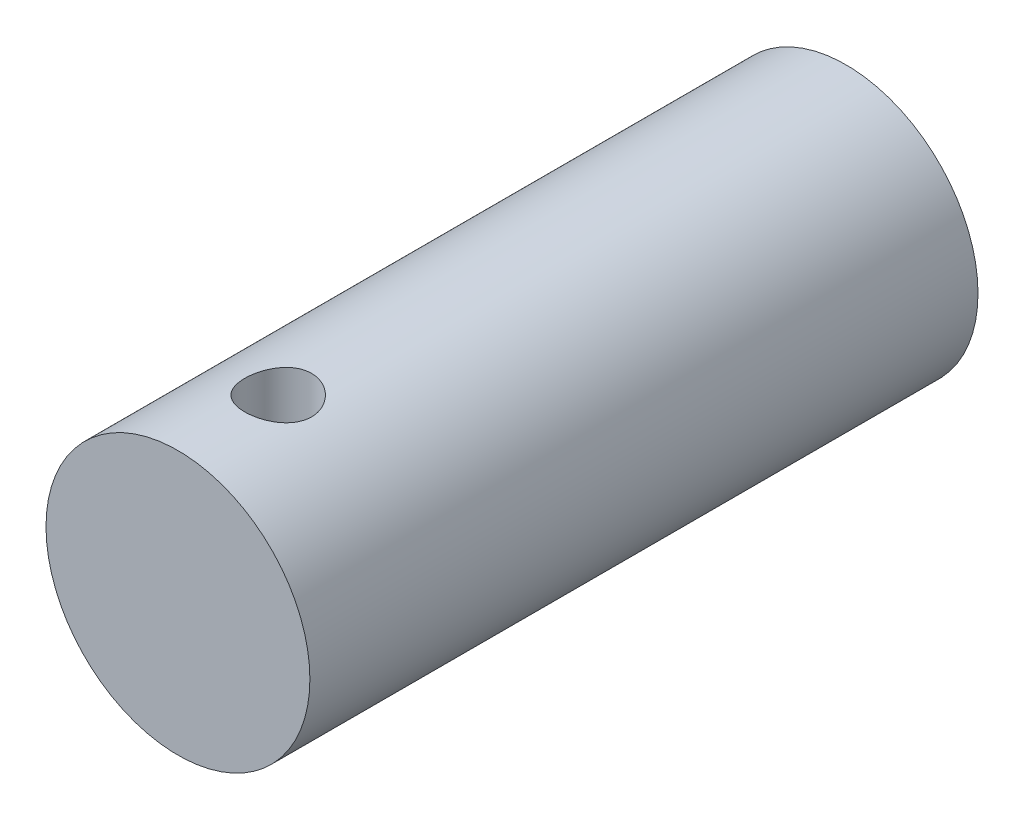
ISO-10303-21;
HEADER;
FILE_DESCRIPTION(('STEP AP214'),'2;1');
FILE_NAME('part.step','',(''),(''),'','','');
FILE_SCHEMA(('AUTOMOTIVE_DESIGN { 1 0 10303 214 1 1 1 1 }'));
ENDSEC;
DATA;
#1=APPLICATION_CONTEXT('core data for automotive mechanical design processes');
#2=APPLICATION_PROTOCOL_DEFINITION('international standard','automotive_design',2000,#1);
#3=PRODUCT_CONTEXT('',#1,'mechanical');
#4=PRODUCT('Part','Part','',(#3));
#5=PRODUCT_RELATED_PRODUCT_CATEGORY('part','',(#4));
#6=PRODUCT_DEFINITION_FORMATION('','',#4);
#7=PRODUCT_DEFINITION_CONTEXT('part definition',#1,'design');
#8=PRODUCT_DEFINITION('design','',#6,#7);
#9=PRODUCT_DEFINITION_SHAPE('','',#8);
#10=(LENGTH_UNIT() NAMED_UNIT(*) SI_UNIT(.MILLI.,.METRE.));
#11=(NAMED_UNIT(*) PLANE_ANGLE_UNIT() SI_UNIT($,.RADIAN.));
#12=(NAMED_UNIT(*) SI_UNIT($,.STERADIAN.) SOLID_ANGLE_UNIT());
#13=UNCERTAINTY_MEASURE_WITH_UNIT(LENGTH_MEASURE(1.E-05),#10,'distance_accuracy_value','');
#14=(GEOMETRIC_REPRESENTATION_CONTEXT(3) GLOBAL_UNCERTAINTY_ASSIGNED_CONTEXT((#13)) GLOBAL_UNIT_ASSIGNED_CONTEXT((#10,
#11,#12)) REPRESENTATION_CONTEXT('',''));
#15=CARTESIAN_POINT('',(0.,0.,0.));
#16=DIRECTION('',(0.,0.,1.));
#17=DIRECTION('',(1.,0.,0.));
#18=AXIS2_PLACEMENT_3D('',#15,#16,#17);
#19=CARTESIAN_POINT('',(0.,0.,20.));
#20=DIRECTION('',(0.,0.,-1.));
#21=DIRECTION('',(-1.,0.,0.));
#22=AXIS2_PLACEMENT_3D('',#19,#20,#21);
#23=CYLINDRICAL_SURFACE('',#22,3.95);
#24=CARTESIAN_POINT('',(0.,-3.95,18.));
#25=CARTESIAN_POINT('',(0.0552278420748469,-3.94999908204684,17.9999984919513));
#26=CARTESIAN_POINT('',(0.110472396400867,-3.94883021486781,17.9954094463953));
#27=CARTESIAN_POINT('',(0.219376684770794,-3.9442806794472,17.97720292985));
#28=CARTESIAN_POINT('',(0.27303552875615,-3.94089879279058,17.963580485316));
#29=CARTESIAN_POINT('',(0.377180122437892,-3.93229748362604,17.9277734243036));
#30=CARTESIAN_POINT('',(0.427669648348493,-3.92708029878769,17.905599231305));
#31=CARTESIAN_POINT('',(0.524212415434038,-3.91536323222111,17.853355156036));
#32=CARTESIAN_POINT('',(0.570265479338116,-3.90886329926881,17.8232849584381));
#33=CARTESIAN_POINT('',(0.657598787580676,-3.89513247989479,17.7554330059679));
#34=CARTESIAN_POINT('',(0.698772196504418,-3.88789008700224,17.7175160639065));
#35=CARTESIAN_POINT('',(0.774248675231096,-3.87356657479427,17.6353362974195));
#36=CARTESIAN_POINT('',(0.808550949886455,-3.86648547422801,17.5910727395611));
#37=CARTESIAN_POINT('',(0.869817310360346,-3.85316997858545,17.4966223853375));
#38=CARTESIAN_POINT('',(0.896661257761203,-3.8469501747132,17.4463554153543));
#39=CARTESIAN_POINT('',(0.941476144800429,-3.83622956373611,17.3418392875935));
#40=CARTESIAN_POINT('',(0.959448542826903,-3.83172847412054,17.2875907860226));
#41=CARTESIAN_POINT('',(0.985644478007742,-3.82507328273172,17.1778278560477));
#42=CARTESIAN_POINT('',(0.994060408757436,-3.82287293653174,17.1223622138155));
#43=CARTESIAN_POINT('',(1.00150389012776,-3.82092998774723,17.0107660302749));
#44=CARTESIAN_POINT('',(1.00053300964121,-3.8211869744489,16.9546356016439));
#45=CARTESIAN_POINT('',(0.98938378930083,-3.82408811953594,16.8447827031134));
#46=CARTESIAN_POINT('',(0.979435358626881,-3.826672667255,16.7910350782057));
#47=CARTESIAN_POINT('',(0.950980465859901,-3.83384263855054,16.6859976717028));
#48=CARTESIAN_POINT('',(0.932473380267746,-3.83842820790033,16.6347080694755));
#49=CARTESIAN_POINT('',(0.887232199279391,-3.84913783092387,16.5354293350022));
#50=CARTESIAN_POINT('',(0.860415192377698,-3.85527726966643,16.4874797148559));
#51=CARTESIAN_POINT('',(0.799373363875984,-3.86839426326203,16.3966789214503));
#52=CARTESIAN_POINT('',(0.765147215691907,-3.87537196810434,16.3538286633482));
#53=CARTESIAN_POINT('',(0.689070600726196,-3.88962974437686,16.2731261564652));
#54=CARTESIAN_POINT('',(0.647026292795693,-3.89691268804759,16.2354569106575));
#55=CARTESIAN_POINT('',(0.557129757116956,-3.91077635595212,16.1676685772219));
#56=CARTESIAN_POINT('',(0.509277343022367,-3.91735705764256,16.137549731935));
#57=CARTESIAN_POINT('',(0.408857714757762,-3.92910890000828,16.085647507278));
#58=CARTESIAN_POINT('',(0.356274170552657,-3.93427488867099,16.0638944807668));
#59=CARTESIAN_POINT('',(0.248036539264747,-3.94257781835689,16.029588127079));
#60=CARTESIAN_POINT('',(0.192383057256601,-3.94571515768035,16.017032993945));
#61=CARTESIAN_POINT('',(0.0811494612569926,-3.94954811388858,16.0017597574516));
#62=CARTESIAN_POINT('',(0.0256056354836739,-3.95030555646106,15.9987925174488));
#63=CARTESIAN_POINT('',(-0.0851851389097121,-3.94946977470528,16.0020951088027));
#64=CARTESIAN_POINT('',(-0.140432114506926,-3.94787676773552,16.0083640860373));
#65=CARTESIAN_POINT('',(-0.24819084473572,-3.94255875874206,16.029755979187));
#66=CARTESIAN_POINT('',(-0.30073146299795,-3.93886663987927,16.0447424155926));
#67=CARTESIAN_POINT('',(-0.402549796122122,-3.92976700717265,16.0829874461133));
#68=CARTESIAN_POINT('',(-0.451827176068225,-3.92435931758351,16.1062468877555));
#69=CARTESIAN_POINT('',(-0.546707172047591,-3.91228090485966,16.1608566564906));
#70=CARTESIAN_POINT('',(-0.592227150944137,-3.90558909631277,16.1923457822197));
#71=CARTESIAN_POINT('',(-0.677425134789229,-3.89171704587319,16.2623441926733));
#72=CARTESIAN_POINT('',(-0.717102102215168,-3.88453671756594,16.3008547214526));
#73=CARTESIAN_POINT('',(-0.790518789323268,-3.87027341917479,16.3849606856098));
#74=CARTESIAN_POINT('',(-0.824083545405224,-3.86319747090773,16.4307103011257));
#75=CARTESIAN_POINT('',(-0.883059964621527,-3.85014558107987,16.5273391068464));
#76=CARTESIAN_POINT('',(-0.908471987221515,-3.84416959102531,16.5782180707609));
#77=CARTESIAN_POINT('',(-0.950231584598359,-3.83406073969026,16.683391004948));
#78=CARTESIAN_POINT('',(-0.96663279213701,-3.82991700223301,16.7376625795714));
#79=CARTESIAN_POINT('',(-0.990044181657134,-3.82393269795229,16.8483142073805));
#80=CARTESIAN_POINT('',(-0.997056480178927,-3.82209161204859,16.9046937824133));
#81=CARTESIAN_POINT('',(-1.00137829764814,-3.82096134400262,17.0161786121732));
#82=CARTESIAN_POINT('',(-0.998967740557094,-3.82159853697847,17.0712724404118));
#83=CARTESIAN_POINT('',(-0.985154533235013,-3.82518240754788,17.1802405863909));
#84=CARTESIAN_POINT('',(-0.973752072713341,-3.82812903641742,17.2341149298351));
#85=CARTESIAN_POINT('',(-0.942433404844572,-3.83595820613518,17.3388015753129));
#86=CARTESIAN_POINT('',(-0.922570964111821,-3.8408285072964,17.3896309410624));
#87=CARTESIAN_POINT('',(-0.874938511416826,-3.85195770365967,17.4872725232274));
#88=CARTESIAN_POINT('',(-0.847167375213231,-3.85821679625402,17.5340841672814));
#89=CARTESIAN_POINT('',(-0.783633699377765,-3.87162721456458,17.6237111284221));
#90=CARTESIAN_POINT('',(-0.747677518801082,-3.8787979067106,17.6663863039087));
#91=CARTESIAN_POINT('',(-0.669170094379428,-3.8931093778377,17.7451882925208));
#92=CARTESIAN_POINT('',(-0.626617280405068,-3.90025014928039,17.7813135421814));
#93=CARTESIAN_POINT('',(-0.535163954139943,-3.91385664534171,17.8466500449191));
#94=CARTESIAN_POINT('',(-0.486159605851861,-3.92030724668928,17.8757193487147));
#95=CARTESIAN_POINT('',(-0.383800172167365,-3.93164601340821,17.9251609888441));
#96=CARTESIAN_POINT('',(-0.330448176331422,-3.93653527636488,17.9455394380465));
#97=CARTESIAN_POINT('',(-0.231008135572119,-3.9434943052563,17.9740634112027));
#98=CARTESIAN_POINT('',(-0.185385804626639,-3.94591699651009,17.9837683239816));
#99=CARTESIAN_POINT('',(-0.0931795635500843,-3.94917016803465,17.996736999342));
#100=CARTESIAN_POINT('',(-0.0465957299132142,-3.95000077447707,18.0000012723407));
#101=CARTESIAN_POINT('',(0.,-3.95,18.));
#102=B_SPLINE_CURVE_WITH_KNOTS('',3,(#24,#25,#26,#27,#28,#29,#30,#31,#32,#33,#34,#35,#36,#37,
#38,#39,#40,#41,#42,#43,#44,#45,#46,#47,#48,#49,#50,#51,#52,#53,#54,#55,#56,#57,#58,#59,#60,#61,
#62,#63,#64,#65,#66,#67,#68,#69,#70,#71,#72,#73,#74,#75,#76,#77,#78,#79,#80,#81,#82,#83,#84,#85,
#86,#87,#88,#89,#90,#91,#92,#93,#94,#95,#96,#97,#98,#99,#100,#101),.UNSPECIFIED.,.T.,.F.,(4,2,2,
2,2,2,2,2,2,2,2,2,2,2,2,2,2,2,2,2,2,2,2,2,2,2,2,2,2,2,2,2,2,2,2,2,2,2,4),(0.,0.165512747530338,
0.331116697640765,0.496519432574112,0.661928773883154,0.830468884011725,0.999028486836985,
1.17016372163742,1.34127081425357,1.50886841059759,1.6764379954995,1.83983434666397,
2.00324260314947,2.16833681236569,2.3334606056793,2.50341757273773,2.67337999411055,
2.84395338273747,3.01449327120703,3.18056455367168,3.34662047960915,3.51014407075123,
3.67368441887731,3.84018425250062,4.00671361534653,4.17744263350462,4.34816412294207,
4.51785814720793,4.6875139109316,4.85216858434357,5.01681978399747,5.18043981589751,
5.34408311842491,5.51209741294959,5.68015175977974,5.8513492293213,6.02242608465512,
6.16208025636819,6.30172336012491),.UNSPECIFIED.);
#103=CARTESIAN_POINT('',(0.,-3.95,18.));
#104=VERTEX_POINT('',#103);
#105=EDGE_CURVE('E46',#104,#104,#102,.T.);
#106=ORIENTED_EDGE('',*,*,#105,.T.);
#107=EDGE_LOOP('',(#106));
#108=FACE_BOUND('',#107,.T.);
#109=CARTESIAN_POINT('',(0.,3.95,18.));
#110=CARTESIAN_POINT('',(-0.0552278420748467,3.94999908204684,17.9999984919513));
#111=CARTESIAN_POINT('',(-0.110472396400866,3.94883021486781,17.9954094463953));
#112=CARTESIAN_POINT('',(-0.219376684770793,3.9442806794472,17.97720292985));
#113=CARTESIAN_POINT('',(-0.27303552875615,3.94089879279058,17.963580485316));
#114=CARTESIAN_POINT('',(-0.377180122437892,3.93229748362604,17.9277734243036));
#115=CARTESIAN_POINT('',(-0.427669648348493,3.92708029878769,17.905599231305));
#116=CARTESIAN_POINT('',(-0.524212415434038,3.91536323222111,17.853355156036));
#117=CARTESIAN_POINT('',(-0.570265479338116,3.90886329926881,17.8232849584381));
#118=CARTESIAN_POINT('',(-0.657598787580675,3.89513247989479,17.7554330059679));
#119=CARTESIAN_POINT('',(-0.698772196504418,3.88789008700224,17.7175160639065));
#120=CARTESIAN_POINT('',(-0.774248675231096,3.87356657479427,17.6353362974195));
#121=CARTESIAN_POINT('',(-0.808550949886455,3.86648547422801,17.5910727395611));
#122=CARTESIAN_POINT('',(-0.869817310360346,3.85316997858545,17.4966223853375));
#123=CARTESIAN_POINT('',(-0.896661257761203,3.8469501747132,17.4463554153543));
#124=CARTESIAN_POINT('',(-0.941476144800429,3.83622956373611,17.3418392875935));
#125=CARTESIAN_POINT('',(-0.959448542826903,3.83172847412054,17.2875907860226));
#126=CARTESIAN_POINT('',(-0.985644478007742,3.82507328273172,17.1778278560477));
#127=CARTESIAN_POINT('',(-0.994060408757436,3.82287293653174,17.1223622138155));
#128=CARTESIAN_POINT('',(-1.00150389012776,3.82092998774723,17.0107660302749));
#129=CARTESIAN_POINT('',(-1.00053300964121,3.8211869744489,16.9546356016439));
#130=CARTESIAN_POINT('',(-0.98938378930083,3.82408811953594,16.8447827031134));
#131=CARTESIAN_POINT('',(-0.979435358626881,3.826672667255,16.7910350782057));
#132=CARTESIAN_POINT('',(-0.950980465859901,3.83384263855054,16.6859976717028));
#133=CARTESIAN_POINT('',(-0.932473380267746,3.83842820790033,16.6347080694755));
#134=CARTESIAN_POINT('',(-0.887232199279391,3.84913783092387,16.5354293350022));
#135=CARTESIAN_POINT('',(-0.860415192377698,3.85527726966643,16.4874797148559));
#136=CARTESIAN_POINT('',(-0.799373363875984,3.86839426326203,16.3966789214503));
#137=CARTESIAN_POINT('',(-0.765147215691907,3.87537196810434,16.3538286633482));
#138=CARTESIAN_POINT('',(-0.689070600726195,3.88962974437686,16.2731261564652));
#139=CARTESIAN_POINT('',(-0.647026292795693,3.89691268804759,16.2354569106575));
#140=CARTESIAN_POINT('',(-0.557129757116955,3.91077635595212,16.1676685772219));
#141=CARTESIAN_POINT('',(-0.509277343022367,3.91735705764256,16.137549731935));
#142=CARTESIAN_POINT('',(-0.408857714757762,3.92910890000828,16.085647507278));
#143=CARTESIAN_POINT('',(-0.356274170552657,3.93427488867099,16.0638944807668));
#144=CARTESIAN_POINT('',(-0.248036539264748,3.94257781835689,16.029588127079));
#145=CARTESIAN_POINT('',(-0.192383057256601,3.94571515768035,16.017032993945));
#146=CARTESIAN_POINT('',(-0.0811494612569926,3.94954811388858,16.0017597574516));
#147=CARTESIAN_POINT('',(-0.0256056354836739,3.95030555646106,15.9987925174488));
#148=CARTESIAN_POINT('',(0.0851851389097121,3.94946977470528,16.0020951088027));
#149=CARTESIAN_POINT('',(0.140432114506926,3.94787676773552,16.0083640860373));
#150=CARTESIAN_POINT('',(0.24819084473572,3.94255875874206,16.029755979187));
#151=CARTESIAN_POINT('',(0.30073146299795,3.93886663987927,16.0447424155926));
#152=CARTESIAN_POINT('',(0.402549796122122,3.92976700717265,16.0829874461133));
#153=CARTESIAN_POINT('',(0.451827176068225,3.92435931758351,16.1062468877555));
#154=CARTESIAN_POINT('',(0.546707172047591,3.91228090485966,16.1608566564906));
#155=CARTESIAN_POINT('',(0.592227150944137,3.90558909631277,16.1923457822197));
#156=CARTESIAN_POINT('',(0.677425134789229,3.89171704587319,16.2623441926733));
#157=CARTESIAN_POINT('',(0.717102102215169,3.88453671756594,16.3008547214526));
#158=CARTESIAN_POINT('',(0.790518789323267,3.87027341917479,16.3849606856097));
#159=CARTESIAN_POINT('',(0.824083545405221,3.86319747090773,16.4307103011257));
#160=CARTESIAN_POINT('',(0.883059964621525,3.85014558107988,16.5273391068464));
#161=CARTESIAN_POINT('',(0.908471987221515,3.84416959102531,16.5782180707609));
#162=CARTESIAN_POINT('',(0.950231584598359,3.83406073969026,16.683391004948));
#163=CARTESIAN_POINT('',(0.96663279213701,3.82991700223301,16.7376625795714));
#164=CARTESIAN_POINT('',(0.990044181657134,3.82393269795229,16.8483142073805));
#165=CARTESIAN_POINT('',(0.997056480178927,3.82209161204859,16.9046937824133));
#166=CARTESIAN_POINT('',(1.00137829764814,3.82096134400262,17.0161786121732));
#167=CARTESIAN_POINT('',(0.998967740557094,3.82159853697847,17.0712724404118));
#168=CARTESIAN_POINT('',(0.985154533235013,3.82518240754788,17.1802405863909));
#169=CARTESIAN_POINT('',(0.973752072713341,3.82812903641742,17.2341149298351));
#170=CARTESIAN_POINT('',(0.942433404844572,3.83595820613518,17.3388015753129));
#171=CARTESIAN_POINT('',(0.922570964111821,3.8408285072964,17.3896309410624));
#172=CARTESIAN_POINT('',(0.874938511416826,3.85195770365967,17.4872725232274));
#173=CARTESIAN_POINT('',(0.847167375213231,3.85821679625402,17.5340841672814));
#174=CARTESIAN_POINT('',(0.783633699377765,3.87162721456458,17.6237111284221));
#175=CARTESIAN_POINT('',(0.747677518801082,3.8787979067106,17.6663863039087));
#176=CARTESIAN_POINT('',(0.669170094379428,3.8931093778377,17.7451882925208));
#177=CARTESIAN_POINT('',(0.626617280405068,3.90025014928039,17.7813135421814));
#178=CARTESIAN_POINT('',(0.535163954139943,3.91385664534171,17.8466500449191));
#179=CARTESIAN_POINT('',(0.486159605851861,3.92030724668928,17.8757193487147));
#180=CARTESIAN_POINT('',(0.383800172167365,3.93164601340821,17.9251609888441));
#181=CARTESIAN_POINT('',(0.330448176331422,3.93653527636488,17.9455394380465));
#182=CARTESIAN_POINT('',(0.231008135572118,3.9434943052563,17.9740634112027));
#183=CARTESIAN_POINT('',(0.185385804626639,3.94591699651009,17.9837683239816));
#184=CARTESIAN_POINT('',(0.0931795635500843,3.94917016803465,17.996736999342));
#185=CARTESIAN_POINT('',(0.0465957299132142,3.95000077447708,18.0000012723407));
#186=CARTESIAN_POINT('',(0.,3.95,18.));
#187=B_SPLINE_CURVE_WITH_KNOTS('',3,(#109,#110,#111,#112,#113,#114,#115,#116,#117,#118,#119,
#120,#121,#122,#123,#124,#125,#126,#127,#128,#129,#130,#131,#132,#133,#134,#135,#136,#137,#138,
#139,#140,#141,#142,#143,#144,#145,#146,#147,#148,#149,#150,#151,#152,#153,#154,#155,#156,#157,
#158,#159,#160,#161,#162,#163,#164,#165,#166,#167,#168,#169,#170,#171,#172,#173,#174,#175,#176,
#177,#178,#179,#180,#181,#182,#183,#184,#185,#186),.UNSPECIFIED.,.T.,.F.,(4,2,2,2,2,2,2,2,2,2,2,
2,2,2,2,2,2,2,2,2,2,2,2,2,2,2,2,2,2,2,2,2,2,2,2,2,2,2,4),(0.,0.165512747530337,
0.331116697640765,0.496519432574112,0.661928773883154,0.830468884011725,0.999028486836985,
1.17016372163742,1.34127081425357,1.50886841059759,1.6764379954995,1.83983434666397,
2.00324260314947,2.16833681236569,2.3334606056793,2.50341757273773,2.67337999411055,
2.84395338273747,3.01449327120703,3.18056455367168,3.34662047960915,3.51014407075123,
3.67368441887731,3.84018425250062,4.00671361534653,4.17744263350461,4.34816412294207,
4.51785814720793,4.6875139109316,4.85216858434357,5.01681978399747,5.18043981589751,
5.34408311842491,5.51209741294959,5.68015175977974,5.85134922932129,6.02242608465512,
6.16208025636819,6.30172336012491),.UNSPECIFIED.);
#188=CARTESIAN_POINT('',(0.,3.95,18.));
#189=VERTEX_POINT('',#188);
#190=EDGE_CURVE('E12',#189,#189,#187,.T.);
#191=ORIENTED_EDGE('',*,*,#190,.T.);
#192=EDGE_LOOP('',(#191));
#193=FACE_BOUND('',#192,.T.);
#194=CARTESIAN_POINT('',(0.,0.,20.));
#195=DIRECTION('',(0.,0.,1.));
#196=DIRECTION('',(1.,0.,0.));
#197=AXIS2_PLACEMENT_3D('',#194,#195,#196);
#198=CIRCLE('',#197,3.95);
#199=CARTESIAN_POINT('',(3.95,0.,20.));
#200=VERTEX_POINT('',#199);
#201=EDGE_CURVE('E53',#200,#200,#198,.T.);
#202=ORIENTED_EDGE('',*,*,#201,.F.);
#203=EDGE_LOOP('',(#202));
#204=FACE_BOUND('',#203,.T.);
#205=CARTESIAN_POINT('',(0.,0.,0.));
#206=DIRECTION('',(0.,0.,1.));
#207=DIRECTION('',(1.,0.,0.));
#208=AXIS2_PLACEMENT_3D('',#205,#206,#207);
#209=CIRCLE('',#208,3.95);
#210=CARTESIAN_POINT('',(3.95,0.,0.));
#211=VERTEX_POINT('',#210);
#212=EDGE_CURVE('E57',#211,#211,#209,.T.);
#213=ORIENTED_EDGE('',*,*,#212,.T.);
#214=EDGE_LOOP('',(#213));
#215=FACE_BOUND('',#214,.T.);
#216=ADVANCED_FACE('F42',(#108,#193,#204,#215),#23,.T.);
#217=CARTESIAN_POINT('',(0.,0.,20.));
#218=DIRECTION('',(0.,0.,1.));
#219=DIRECTION('',(1.,0.,0.));
#220=AXIS2_PLACEMENT_3D('',#217,#218,#219);
#221=PLANE('',#220);
#222=ORIENTED_EDGE('',*,*,#201,.T.);
#223=EDGE_LOOP('',(#222));
#224=FACE_BOUND('',#223,.T.);
#225=ADVANCED_FACE('F68',(#224),#221,.T.);
#226=CARTESIAN_POINT('',(0.,0.,0.));
#227=DIRECTION('',(0.,0.,1.));
#228=DIRECTION('',(1.,0.,0.));
#229=AXIS2_PLACEMENT_3D('',#226,#227,#228);
#230=PLANE('',#229);
#231=ORIENTED_EDGE('',*,*,#212,.F.);
#232=EDGE_LOOP('',(#231));
#233=FACE_BOUND('',#232,.T.);
#234=ADVANCED_FACE('F66',(#233),#230,.F.);
#235=CARTESIAN_POINT('',(0.,-21.05,17.));
#236=DIRECTION('',(0.,1.,0.));
#237=DIRECTION('',(0.,0.,1.));
#238=AXIS2_PLACEMENT_3D('',#235,#236,#237);
#239=CYLINDRICAL_SURFACE('',#238,1.);
#240=ORIENTED_EDGE('',*,*,#105,.F.);
#241=EDGE_LOOP('',(#240));
#242=FACE_BOUND('',#241,.T.);
#243=ORIENTED_EDGE('',*,*,#190,.F.);
#244=EDGE_LOOP('',(#243));
#245=FACE_BOUND('',#244,.T.);
#246=ADVANCED_FACE('F62',(#242,#245),#239,.F.);
#247=CLOSED_SHELL('',(#216,#225,#234,#246));
#248=MANIFOLD_SOLID_BREP('B2',#247);
#249=ADVANCED_BREP_SHAPE_REPRESENTATION('',(#18,#248),#14);
#250=SHAPE_DEFINITION_REPRESENTATION(#9,#249);
ENDSEC;
END-ISO-10303-21;
